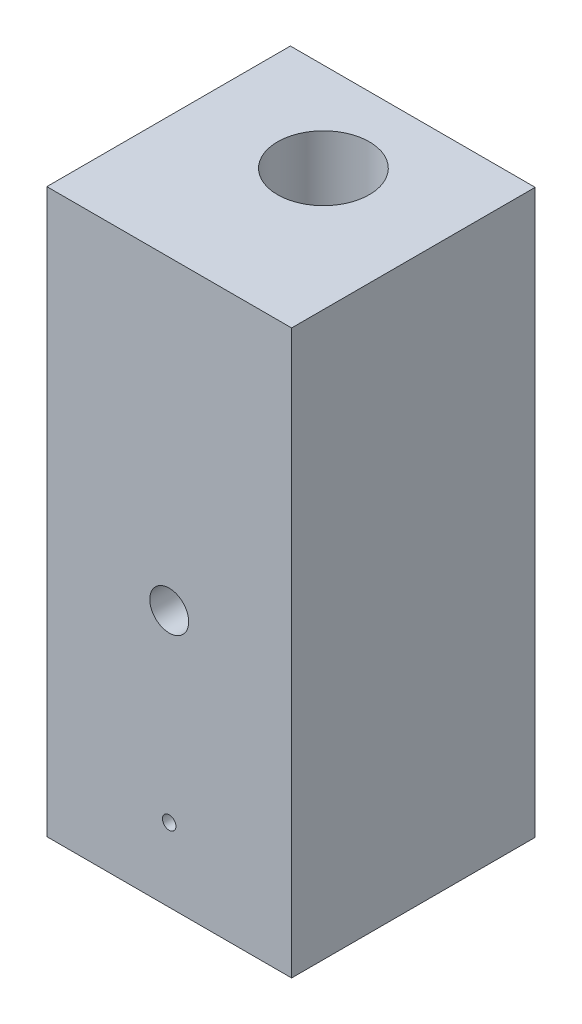
ISO-10303-21;
HEADER;
FILE_DESCRIPTION(('STEP AP214'),'2;1');
FILE_NAME('part.step','',(''),(''),'','','');
FILE_SCHEMA(('AUTOMOTIVE_DESIGN { 1 0 10303 214 1 1 1 1 }'));
ENDSEC;
DATA;
#1=APPLICATION_CONTEXT('core data for automotive mechanical design processes');
#2=APPLICATION_PROTOCOL_DEFINITION('international standard','automotive_design',2000,#1);
#3=PRODUCT_CONTEXT('',#1,'mechanical');
#4=PRODUCT('Part','Part','',(#3));
#5=PRODUCT_RELATED_PRODUCT_CATEGORY('part','',(#4));
#6=PRODUCT_DEFINITION_FORMATION('','',#4);
#7=PRODUCT_DEFINITION_CONTEXT('part definition',#1,'design');
#8=PRODUCT_DEFINITION('design','',#6,#7);
#9=PRODUCT_DEFINITION_SHAPE('','',#8);
#10=(LENGTH_UNIT() NAMED_UNIT(*) SI_UNIT(.MILLI.,.METRE.));
#11=(NAMED_UNIT(*) PLANE_ANGLE_UNIT() SI_UNIT($,.RADIAN.));
#12=(NAMED_UNIT(*) SI_UNIT($,.STERADIAN.) SOLID_ANGLE_UNIT());
#13=UNCERTAINTY_MEASURE_WITH_UNIT(LENGTH_MEASURE(1.E-05),#10,'distance_accuracy_value','');
#14=(GEOMETRIC_REPRESENTATION_CONTEXT(3) GLOBAL_UNCERTAINTY_ASSIGNED_CONTEXT((#13)) GLOBAL_UNIT_ASSIGNED_CONTEXT((#10,
#11,#12)) REPRESENTATION_CONTEXT('',''));
#15=CARTESIAN_POINT('',(0.,0.,0.));
#16=DIRECTION('',(0.,0.,1.));
#17=DIRECTION('',(1.,0.,0.));
#18=AXIS2_PLACEMENT_3D('',#15,#16,#17);
#19=CARTESIAN_POINT('',(-25.4,58.4200000000003,-25.2729999999999));
#20=DIRECTION('',(1.,0.,0.));
#21=DIRECTION('',(0.,0.,-0.999999999999998));
#22=AXIS2_PLACEMENT_3D('',#19,#20,#21);
#23=PLANE('',#22);
#24=DIRECTION('',(0.,0.,0.999999999999998));
#25=VECTOR('',#24,1.);
#26=CARTESIAN_POINT('',(-25.4,2.35922392732846E-13,-25.2729999999999));
#27=LINE('',#26,#25);
#28=CARTESIAN_POINT('',(-25.4,2.35922392732846E-13,-25.2729999999999));
#29=VERTEX_POINT('',#28);
#30=CARTESIAN_POINT('',(-25.4,0.,0.));
#31=VERTEX_POINT('',#30);
#32=EDGE_CURVE('E128',#29,#31,#27,.T.);
#33=ORIENTED_EDGE('',*,*,#32,.T.);
#34=DIRECTION('',(0.,-1.,0.));
#35=VECTOR('',#34,1.);
#36=CARTESIAN_POINT('',(-25.4,58.4200000000002,0.));
#37=LINE('',#36,#35);
#38=CARTESIAN_POINT('',(-25.4,58.4200000000002,0.));
#39=VERTEX_POINT('',#38);
#40=EDGE_CURVE('E149',#39,#31,#37,.T.);
#41=ORIENTED_EDGE('',*,*,#40,.F.);
#42=DIRECTION('',(0.,0.,0.999999999999998));
#43=VECTOR('',#42,1.);
#44=CARTESIAN_POINT('',(-25.4,58.4200000000003,-25.2729999999999));
#45=LINE('',#44,#43);
#46=CARTESIAN_POINT('',(-25.4,58.4200000000003,-25.2729999999999));
#47=VERTEX_POINT('',#46);
#48=EDGE_CURVE('E129',#47,#39,#45,.T.);
#49=ORIENTED_EDGE('',*,*,#48,.F.);
#50=DIRECTION('',(0.,-1.,0.));
#51=VECTOR('',#50,1.);
#52=CARTESIAN_POINT('',(-25.4,58.4200000000003,-25.2729999999999));
#53=LINE('',#52,#51);
#54=EDGE_CURVE('E135',#47,#29,#53,.T.);
#55=ORIENTED_EDGE('',*,*,#54,.T.);
#56=EDGE_LOOP('',(#33,#41,#49,#55));
#57=FACE_BOUND('',#56,.T.);
#58=ADVANCED_FACE('F40',(#57),#23,.F.);
#59=CARTESIAN_POINT('',(-25.4,58.4200000000002,0.));
#60=DIRECTION('',(0.,0.,-0.999999999999998));
#61=DIRECTION('',(-1.,0.,0.));
#62=AXIS2_PLACEMENT_3D('',#59,#60,#61);
#63=PLANE('',#62);
#64=CARTESIAN_POINT('',(-12.6999999999999,26.6700000000002,0.));
#65=DIRECTION('',(0.,0.,0.999999999999998));
#66=DIRECTION('',(1.,0.,0.));
#67=AXIS2_PLACEMENT_3D('',#64,#65,#66);
#68=CIRCLE('',#67,2.0193);
#69=CARTESIAN_POINT('',(-10.6806999999999,26.6700000000002,0.));
#70=VERTEX_POINT('',#69);
#71=EDGE_CURVE('E117',#70,#70,#68,.T.);
#72=ORIENTED_EDGE('',*,*,#71,.F.);
#73=EDGE_LOOP('',(#72));
#74=FACE_BOUND('',#73,.T.);
#75=CARTESIAN_POINT('',(-12.7,7.62,0.));
#76=DIRECTION('',(0.,0.,0.999999999999998));
#77=DIRECTION('',(1.,0.,0.));
#78=AXIS2_PLACEMENT_3D('',#75,#76,#77);
#79=CIRCLE('',#78,0.698499999999989);
#80=CARTESIAN_POINT('',(-12.0015,7.62,0.));
#81=VERTEX_POINT('',#80);
#82=EDGE_CURVE('E125',#81,#81,#79,.T.);
#83=ORIENTED_EDGE('',*,*,#82,.F.);
#84=EDGE_LOOP('',(#83));
#85=FACE_BOUND('',#84,.T.);
#86=DIRECTION('',(1.,0.,0.));
#87=VECTOR('',#86,1.);
#88=CARTESIAN_POINT('',(-25.4,0.,0.));
#89=LINE('',#88,#87);
#90=CARTESIAN_POINT('',(0.,0.,0.));
#91=VERTEX_POINT('',#90);
#92=EDGE_CURVE('E138',#31,#91,#89,.T.);
#93=ORIENTED_EDGE('',*,*,#92,.T.);
#94=DIRECTION('',(0.,-1.,0.));
#95=VECTOR('',#94,1.);
#96=CARTESIAN_POINT('',(0.,58.4200000000002,0.));
#97=LINE('',#96,#95);
#98=CARTESIAN_POINT('',(0.,58.4200000000002,0.));
#99=VERTEX_POINT('',#98);
#100=EDGE_CURVE('E146',#99,#91,#97,.T.);
#101=ORIENTED_EDGE('',*,*,#100,.F.);
#102=DIRECTION('',(1.,0.,0.));
#103=VECTOR('',#102,1.);
#104=CARTESIAN_POINT('',(-25.4,58.4200000000002,0.));
#105=LINE('',#104,#103);
#106=EDGE_CURVE('E97',#39,#99,#105,.T.);
#107=ORIENTED_EDGE('',*,*,#106,.F.);
#108=ORIENTED_EDGE('',*,*,#40,.T.);
#109=EDGE_LOOP('',(#93,#101,#107,#108));
#110=FACE_BOUND('',#109,.T.);
#111=ADVANCED_FACE('F172',(#74,#85,#110),#63,.F.);
#112=CARTESIAN_POINT('',(0.,58.4200000000003,-25.2729999999999));
#113=DIRECTION('',(-1.,0.,0.));
#114=DIRECTION('',(0.,0.,0.999999999999998));
#115=AXIS2_PLACEMENT_3D('',#112,#113,#114);
#116=PLANE('',#115);
#117=DIRECTION('',(0.,0.,-0.999999999999998));
#118=VECTOR('',#117,1.);
#119=CARTESIAN_POINT('',(0.,0.,-25.2729999999999));
#120=LINE('',#119,#118);
#121=CARTESIAN_POINT('',(0.,0.,-25.2729999999999));
#122=VERTEX_POINT('',#121);
#123=EDGE_CURVE('E140',#91,#122,#120,.T.);
#124=ORIENTED_EDGE('',*,*,#123,.T.);
#125=DIRECTION('',(0.,-1.,0.));
#126=VECTOR('',#125,1.);
#127=CARTESIAN_POINT('',(0.,58.4200000000003,-25.2729999999999));
#128=LINE('',#127,#126);
#129=CARTESIAN_POINT('',(0.,58.4200000000003,-25.2729999999999));
#130=VERTEX_POINT('',#129);
#131=EDGE_CURVE('E144',#130,#122,#128,.T.);
#132=ORIENTED_EDGE('',*,*,#131,.F.);
#133=DIRECTION('',(0.,0.,-0.999999999999998));
#134=VECTOR('',#133,1.);
#135=CARTESIAN_POINT('',(0.,58.4200000000003,-25.2729999999999));
#136=LINE('',#135,#134);
#137=EDGE_CURVE('E132',#99,#130,#136,.T.);
#138=ORIENTED_EDGE('',*,*,#137,.F.);
#139=ORIENTED_EDGE('',*,*,#100,.T.);
#140=EDGE_LOOP('',(#124,#132,#138,#139));
#141=FACE_BOUND('',#140,.T.);
#142=ADVANCED_FACE('F177',(#141),#116,.F.);
#143=CARTESIAN_POINT('',(-25.4,58.4200000000003,-25.2729999999999));
#144=DIRECTION('',(0.,0.,0.999999999999998));
#145=DIRECTION('',(1.,0.,0.));
#146=AXIS2_PLACEMENT_3D('',#143,#144,#145);
#147=PLANE('',#146);
#148=DIRECTION('',(-1.,0.,0.));
#149=VECTOR('',#148,1.);
#150=CARTESIAN_POINT('',(-25.4,2.35922392732846E-13,-25.2729999999999));
#151=LINE('',#150,#149);
#152=EDGE_CURVE('E89',#122,#29,#151,.T.);
#153=ORIENTED_EDGE('',*,*,#152,.T.);
#154=ORIENTED_EDGE('',*,*,#54,.F.);
#155=DIRECTION('',(-1.,0.,0.));
#156=VECTOR('',#155,1.);
#157=CARTESIAN_POINT('',(-25.4,58.4200000000003,-25.2729999999999));
#158=LINE('',#157,#156);
#159=EDGE_CURVE('E68',#130,#47,#158,.T.);
#160=ORIENTED_EDGE('',*,*,#159,.F.);
#161=ORIENTED_EDGE('',*,*,#131,.T.);
#162=EDGE_LOOP('',(#153,#154,#160,#161));
#163=FACE_BOUND('',#162,.T.);
#164=ADVANCED_FACE('F190',(#163),#147,.F.);
#165=CARTESIAN_POINT('',(0.,58.4200000000002,0.));
#166=DIRECTION('',(0.,1.,0.));
#167=DIRECTION('',(0.,0.,0.999999999999998));
#168=AXIS2_PLACEMENT_3D('',#165,#166,#167);
#169=PLANE('',#168);
#170=CARTESIAN_POINT('',(-12.7,58.4200000000003,-16.0019999999999));
#171=DIRECTION('',(0.,1.,0.));
#172=DIRECTION('',(0.,0.,0.999999999999998));
#173=AXIS2_PLACEMENT_3D('',#170,#171,#172);
#174=CIRCLE('',#173,4.76249999999999);
#175=CARTESIAN_POINT('',(-12.7,58.4200000000003,-11.2395));
#176=VERTEX_POINT('',#175);
#177=EDGE_CURVE('E116',#176,#176,#174,.T.);
#178=ORIENTED_EDGE('',*,*,#177,.F.);
#179=EDGE_LOOP('',(#178));
#180=FACE_BOUND('',#179,.T.);
#181=ORIENTED_EDGE('',*,*,#48,.T.);
#182=ORIENTED_EDGE('',*,*,#106,.T.);
#183=ORIENTED_EDGE('',*,*,#137,.T.);
#184=ORIENTED_EDGE('',*,*,#159,.T.);
#185=EDGE_LOOP('',(#181,#182,#183,#184));
#186=FACE_BOUND('',#185,.T.);
#187=ADVANCED_FACE('F188',(#180,#186),#169,.T.);
#188=CARTESIAN_POINT('',(0.,0.,0.));
#189=DIRECTION('',(0.,1.,0.));
#190=DIRECTION('',(0.,0.,0.999999999999998));
#191=AXIS2_PLACEMENT_3D('',#188,#189,#190);
#192=PLANE('',#191);
#193=ORIENTED_EDGE('',*,*,#32,.F.);
#194=ORIENTED_EDGE('',*,*,#152,.F.);
#195=ORIENTED_EDGE('',*,*,#123,.F.);
#196=ORIENTED_EDGE('',*,*,#92,.F.);
#197=EDGE_LOOP('',(#193,#194,#195,#196));
#198=FACE_BOUND('',#197,.T.);
#199=ADVANCED_FACE('F183',(#198),#192,.F.);
#200=CARTESIAN_POINT('',(-12.7,7.62,0.));
#201=DIRECTION('',(0.,0.,0.999999999999998));
#202=DIRECTION('',(1.,0.,0.));
#203=AXIS2_PLACEMENT_3D('',#200,#201,#202);
#204=CYLINDRICAL_SURFACE('',#203,0.698499999999988);
#205=CARTESIAN_POINT('',(-12.0050214050058,7.6900500000002,-11.1726673851839));
#206=CARTESIAN_POINT('',(-12.0020412705705,7.66022917417571,-11.223241267845));
#207=CARTESIAN_POINT('',(-12.00093379731,7.63024628229548,-11.2738434402621));
#208=CARTESIAN_POINT('',(-12.0026317196288,7.57000730792529,-11.3749531695365));
#209=CARTESIAN_POINT('',(-12.0054448958452,7.53975080092828,-11.4254603385015));
#210=CARTESIAN_POINT('',(-12.015181273317,7.4790324951242,-11.5261958210679));
#211=CARTESIAN_POINT('',(-12.0221183359235,7.44857034809296,-11.5764226148807));
#212=CARTESIAN_POINT('',(-12.0404835132236,7.38772779892665,-11.6760501457307));
#213=CARTESIAN_POINT('',(-12.0519073779085,7.35734734674734,-11.7254516185004));
#214=CARTESIAN_POINT('',(-12.0789895842805,7.29870878938825,-11.8200718975552));
#215=CARTESIAN_POINT('',(-12.0943514216076,7.27043307046281,-11.8653634081447));
#216=CARTESIAN_POINT('',(-12.130316531187,7.21444867256865,-11.9543272501982));
#217=CARTESIAN_POINT('',(-12.1509266083328,7.1867407806304,-11.9979973945127));
#218=CARTESIAN_POINT('',(-12.1986830168624,7.13223297051394,-12.0831735421645));
#219=CARTESIAN_POINT('',(-12.2259030006745,7.10544746845078,-12.124648247274));
#220=CARTESIAN_POINT('',(-12.2881750029129,7.0543899217638,-12.2029969027126));
#221=CARTESIAN_POINT('',(-12.3231896838198,7.03010667637082,-12.2398915217076));
#222=CARTESIAN_POINT('',(-12.3827845368245,6.99727142833529,-12.2893777140666));
#223=CARTESIAN_POINT('',(-12.4038937864468,6.98690191560401,-12.3049305698557));
#224=CARTESIAN_POINT('',(-12.4485789045019,6.96786548041233,-12.333377818346));
#225=CARTESIAN_POINT('',(-12.4721546859203,6.95919849792098,-12.3462723047816));
#226=CARTESIAN_POINT('',(-12.5219312005228,6.94407310894033,-12.3687109483714));
#227=CARTESIAN_POINT('',(-12.548160573044,6.9376430835452,-12.3782120904729));
#228=CARTESIAN_POINT('',(-12.602371028045,6.92781170575913,-12.3927160989936));
#229=CARTESIAN_POINT('',(-12.6303486824288,6.92440461373043,-12.3977274902716));
#230=CARTESIAN_POINT('',(-12.6831082420516,6.92127346065017,-12.4023327135503));
#231=CARTESIAN_POINT('',(-12.7078089734466,6.92111257637747,-12.4025690963072));
#232=CARTESIAN_POINT('',(-12.7568301462076,6.92338364927458,-12.3992292622064));
#233=CARTESIAN_POINT('',(-12.7811505401118,6.92581592746363,-12.3956525733114));
#234=CARTESIAN_POINT('',(-12.8264821783092,6.93269862779586,-12.3855087885848));
#235=CARTESIAN_POINT('',(-12.8475938714546,6.93694685007801,-12.3792410812116));
#236=CARTESIAN_POINT('',(-12.888493341564,6.94708324409308,-12.364246343505));
#237=CARTESIAN_POINT('',(-12.9082807767672,6.95297183715944,-12.355518681319));
#238=CARTESIAN_POINT('',(-12.9568502466665,6.96968785738562,-12.3306639104931));
#239=CARTESIAN_POINT('',(-12.9845799211385,6.98144869052194,-12.3131095896));
#240=CARTESIAN_POINT('',(-13.0363778181832,7.00714389985838,-12.2745324982609));
#241=CARTESIAN_POINT('',(-13.0604358325009,7.02108412540108,-12.253500384626));
#242=CARTESIAN_POINT('',(-13.118952686707,7.05941696692092,-12.1953133553278));
#243=CARTESIAN_POINT('',(-13.1506947346067,7.08496038967897,-12.1562048810105));
#244=CARTESIAN_POINT('',(-13.2069665051188,7.13793885193859,-12.0743028027277));
#245=CARTESIAN_POINT('',(-13.2314778619485,7.16537849350842,-12.0315001657243));
#246=CARTESIAN_POINT('',(-13.2723598441239,7.21837095488219,-11.9481061322127));
#247=CARTESIAN_POINT('',(-13.2893046880233,7.24383206467138,-11.9077321943883));
#248=CARTESIAN_POINT('',(-13.3190896657059,7.29517429260609,-11.8257291955556));
#249=CARTESIAN_POINT('',(-13.3319263785554,7.32105574203324,-11.7840991199328));
#250=CARTESIAN_POINT('',(-13.3539913852552,7.37302805106372,-11.6999535197023));
#251=CARTESIAN_POINT('',(-13.3632147688464,7.39911914679496,-11.6574368723212));
#252=CARTESIAN_POINT('',(-13.3783757416931,7.45133765704207,-11.5718390595766));
#253=CARTESIAN_POINT('',(-13.3843125519111,7.47746507869843,-11.5287577628457));
#254=CARTESIAN_POINT('',(-13.3940318642213,7.53492693949516,-11.4335011390342));
#255=CARTESIAN_POINT('',(-13.397136376946,7.5662464187946,-11.3812477544951));
#256=CARTESIAN_POINT('',(-13.399128958079,7.62845114362982,-11.276872908243));
#257=CARTESIAN_POINT('',(-13.3980450243889,7.65933789218389,-11.2247528929705));
#258=CARTESIAN_POINT('',(-13.3949785949941,7.69005000000013,-11.1726673851839));
#259=B_SPLINE_CURVE_WITH_KNOTS('',3,(#205,#206,#207,#208,#209,#210,#211,#212,#213,#214,#215,
#216,#217,#218,#219,#220,#221,#222,#223,#224,#225,#226,#227,#228,#229,#230,#231,#232,#233,#234,
#235,#236,#237,#238,#239,#240,#241,#242,#243,#244,#245,#246,#247,#248,#249,#250,#251,#252,#253,
#254,#255,#256,#257,#258),.UNSPECIFIED.,.F.,.F.,(4,2,2,2,2,2,2,2,2,2,2,2,2,2,2,2,2,2,2,2,2,2,2,
2,2,2,4),(0.,0.176347230871792,0.353044926461322,0.530339929595852,0.707467398027392,
0.873925847820395,1.04060123730469,1.20922671693009,1.37706120661977,1.46142735325517,
1.54579052461926,1.63118803163851,1.71642304542903,1.79009859573353,1.86378326772445,
1.93081036260442,1.99785468946487,2.10184514687969,2.20611965710543,2.37459876081644,
2.54350218386999,2.69523752358917,2.8470988899567,2.9991659152156,3.15126897048523,
3.33411600047879,3.51574290059396),.UNSPECIFIED.);
#260=CARTESIAN_POINT('',(-12.0015,7.62000000000013,-11.2910018042882));
#261=VERTEX_POINT('',#260);
#262=CARTESIAN_POINT('',(-13.3985000000006,7.6200000000002,-11.2910018042881));
#263=VERTEX_POINT('',#262);
#264=EDGE_CURVE('E53',#261,#263,#259,.T.);
#265=ORIENTED_EDGE('',*,*,#264,.T.);
#266=CARTESIAN_POINT('',(-13.3985,7.62000000000022,-11.2910018042882));
#267=CARTESIAN_POINT('',(-13.3985343671812,7.65907219760987,-11.2910207458607));
#268=CARTESIAN_POINT('',(-13.3952237812843,7.69812962345121,-11.2905162326507));
#269=CARTESIAN_POINT('',(-13.3821720062785,7.77508675138328,-11.2886014994806));
#270=CARTESIAN_POINT('',(-13.3724384168606,7.81298776635789,-11.2871923499385));
#271=CARTESIAN_POINT('',(-13.3467952925011,7.8866114309862,-11.2836084358949));
#272=CARTESIAN_POINT('',(-13.3308840577612,7.92233347795708,-11.2814334606893));
#273=CARTESIAN_POINT('',(-13.2933578315365,7.99060098881046,-11.2765696716861));
#274=CARTESIAN_POINT('',(-13.2717430329434,8.02314656006882,-11.2738808752664));
#275=CARTESIAN_POINT('',(-13.223246755594,8.08438236427959,-11.2682682298601));
#276=CARTESIAN_POINT('',(-13.1963307399931,8.11304511537536,-11.2653429179124));
#277=CARTESIAN_POINT('',(-13.1380681629796,8.16546713306153,-11.2595999723489));
#278=CARTESIAN_POINT('',(-13.1067209260167,8.18922565062838,-11.2567823552347));
#279=CARTESIAN_POINT('',(-13.0403099618181,8.23126318176781,-11.2515570642992));
#280=CARTESIAN_POINT('',(-13.0052299118932,8.24951666941761,-11.2491513218768));
#281=CARTESIAN_POINT('',(-12.9324628295792,8.27986128751393,-11.2450373489438));
#282=CARTESIAN_POINT('',(-12.8947760808118,8.29195308718855,-11.2433290426877));
#283=CARTESIAN_POINT('',(-12.8181499566706,8.30954842768034,-11.2408126400386));
#284=CARTESIAN_POINT('',(-12.7792214878582,8.31509854101332,-11.239998182925));
#285=CARTESIAN_POINT('',(-12.7009768947978,8.31959756188061,-11.2393394493343));
#286=CARTESIAN_POINT('',(-12.661660781937,8.31854666274989,-11.2394951444428));
#287=CARTESIAN_POINT('',(-12.5840766296107,8.30991008557629,-11.2407541168799));
#288=CARTESIAN_POINT('',(-12.5458028576223,8.30237469023009,-11.2418501027199));
#289=CARTESIAN_POINT('',(-12.4710692122769,8.281061943624,-11.2448583713591));
#290=CARTESIAN_POINT('',(-12.4346093732484,8.26728447428339,-11.2467706696003));
#291=CARTESIAN_POINT('',(-12.3643849916882,8.23382664190187,-11.2512092771374));
#292=CARTESIAN_POINT('',(-12.3306307725357,8.21412491722009,-11.2537378020587));
#293=CARTESIAN_POINT('',(-12.2668898883796,8.16939417328442,-11.2591267594733));
#294=CARTESIAN_POINT('',(-12.2369033108104,8.14436503043527,-11.2619871996663));
#295=CARTESIAN_POINT('',(-12.181254876372,8.08941350913139,-11.2677523145816));
#296=CARTESIAN_POINT('',(-12.1556357339389,8.05944787816127,-11.2706571534663));
#297=CARTESIAN_POINT('',(-12.1097757478662,7.99560911018005,-11.2761585988039));
#298=CARTESIAN_POINT('',(-12.0895364686272,7.96173484068074,-11.2787551154791));
#299=CARTESIAN_POINT('',(-12.0550055699017,7.89099210690942,-11.2833462242533));
#300=CARTESIAN_POINT('',(-12.0407217105297,7.85411981036078,-11.2853400300757));
#301=CARTESIAN_POINT('',(-12.0185819591085,7.77848987093438,-11.2884872054908));
#302=CARTESIAN_POINT('',(-12.01071642505,7.73973514910446,-11.2896418354594));
#303=CARTESIAN_POINT('',(-12.0046128658483,7.68724482254346,-11.2905411910765));
#304=CARTESIAN_POINT('',(-12.0034450177583,7.67381104818646,-11.2907137834529));
#305=CARTESIAN_POINT('',(-12.0018896164696,7.64692010948942,-11.2909439642406));
#306=CARTESIAN_POINT('',(-12.0015007520823,7.63346302267714,-11.2910017459005));
#307=CARTESIAN_POINT('',(-12.0015,7.62000000000013,-11.2910018042882));
#308=B_SPLINE_CURVE_WITH_KNOTS('',3,(#266,#267,#268,#269,#270,#271,#272,#273,#274,#275,#276,
#277,#278,#279,#280,#281,#282,#283,#284,#285,#286,#287,#288,#289,#290,#291,#292,#293,#294,#295,
#296,#297,#298,#299,#300,#301,#302,#303,#304,#305,#306,#307),.UNSPECIFIED.,.F.,.F.,(4,2,2,2,2,2,
2,2,2,2,2,2,2,2,2,2,2,2,2,2,4),(0.,0.117051326514172,0.233964405755074,0.350909676818209,
0.467850993356415,0.585580995696737,0.703328965656846,0.821614803971634,0.939887792384472,
1.05731356869405,1.17473590577339,1.29125583685846,1.40777797223176,1.52472540595297,
1.64167555313236,1.7597109648983,1.87778066250796,1.9960037317243,2.11404887019174,
2.15448847051979,2.19485994535619),.UNSPECIFIED.);
#309=EDGE_CURVE('E11',#263,#261,#308,.T.);
#310=ORIENTED_EDGE('',*,*,#309,.T.);
#311=EDGE_LOOP('',(#265,#310));
#312=FACE_BOUND('',#311,.T.);
#313=ORIENTED_EDGE('',*,*,#82,.T.);
#314=EDGE_LOOP('',(#313));
#315=FACE_BOUND('',#314,.T.);
#316=ADVANCED_FACE('F156',(#312,#315),#204,.F.);
#317=CARTESIAN_POINT('',(-12.7,58.4200000000003,-16.0019999999999));
#318=DIRECTION('',(0.,1.,0.));
#319=DIRECTION('',(0.,0.,0.999999999999998));
#320=AXIS2_PLACEMENT_3D('',#317,#318,#319);
#321=CYLINDRICAL_SURFACE('',#320,4.76249999999999);
#322=ORIENTED_EDGE('',*,*,#177,.T.);
#323=EDGE_LOOP('',(#322));
#324=FACE_BOUND('',#323,.T.);
#325=CARTESIAN_POINT('',(-12.7,7.62000000000011,-16.0019999999999));
#326=DIRECTION('',(0.,1.,0.));
#327=DIRECTION('',(0.,0.,0.999999999999998));
#328=AXIS2_PLACEMENT_3D('',#325,#326,#327);
#329=CIRCLE('',#328,4.76249999999998);
#330=EDGE_CURVE('E59',#261,#263,#329,.T.);
#331=ORIENTED_EDGE('',*,*,#330,.F.);
#332=ORIENTED_EDGE('',*,*,#309,.F.);
#333=EDGE_LOOP('',(#331,#332));
#334=FACE_BOUND('',#333,.T.);
#335=ADVANCED_FACE('F161',(#324,#334),#321,.F.);
#336=CARTESIAN_POINT('',(-12.7,7.62000000000011,-16.0019999999999));
#337=DIRECTION('',(0.,1.,0.));
#338=DIRECTION('',(0.,0.,0.999999999999998));
#339=AXIS2_PLACEMENT_3D('',#336,#337,#338);
#340=CONICAL_SURFACE('',#339,4.76249999999998,1.02974425867665);
#341=CARTESIAN_POINT('',(-12.7,4.75840130188136,-16.002));
#342=VERTEX_POINT('',#341);
#343=VERTEX_LOOP('',#342);
#344=FACE_BOUND('',#343,.T.);
#345=ORIENTED_EDGE('',*,*,#330,.T.);
#346=ORIENTED_EDGE('',*,*,#264,.F.);
#347=EDGE_LOOP('',(#345,#346));
#348=FACE_BOUND('',#347,.T.);
#349=ADVANCED_FACE('F110',(#344,#348),#340,.F.);
#350=CARTESIAN_POINT('',(-12.6999999999999,26.6700000000002,-8.94668215199759));
#351=DIRECTION('',(0.,0.,0.999999999999998));
#352=DIRECTION('',(1.,0.,0.));
#353=AXIS2_PLACEMENT_3D('',#350,#351,#352);
#354=CONICAL_SURFACE('',#353,2.0193,1.02974425867665);
#355=CARTESIAN_POINT('',(-12.6999999999999,26.6700000000002,-10.1599999999999));
#356=VERTEX_POINT('',#355);
#357=VERTEX_LOOP('',#356);
#358=FACE_BOUND('',#357,.T.);
#359=CARTESIAN_POINT('',(-12.6999999999999,26.6700000000002,-8.94668215199759));
#360=DIRECTION('',(0.,0.,0.999999999999998));
#361=DIRECTION('',(1.,0.,0.));
#362=AXIS2_PLACEMENT_3D('',#359,#360,#361);
#363=CIRCLE('',#362,2.0193);
#364=CARTESIAN_POINT('',(-10.6806999999999,26.6700000000002,-8.94668215199759));
#365=VERTEX_POINT('',#364);
#366=EDGE_CURVE('E114',#365,#365,#363,.T.);
#367=ORIENTED_EDGE('',*,*,#366,.T.);
#368=EDGE_LOOP('',(#367));
#369=FACE_BOUND('',#368,.T.);
#370=ADVANCED_FACE('F106',(#358,#369),#354,.F.);
#371=CARTESIAN_POINT('',(-12.6999999999999,26.6700000000002,0.));
#372=DIRECTION('',(0.,0.,0.999999999999998));
#373=DIRECTION('',(1.,0.,0.));
#374=AXIS2_PLACEMENT_3D('',#371,#372,#373);
#375=CYLINDRICAL_SURFACE('',#374,2.0193);
#376=CARTESIAN_POINT('',(-10.6806999999999,26.6700000000002,-8.94668215199759));
#377=CARTESIAN_POINT('',(-10.6806999999999,26.6700000000002,-8.85348754624762));
#378=CARTESIAN_POINT('',(-10.6806999999999,26.6700000000002,-8.76029294049764));
#379=CARTESIAN_POINT('',(-10.6806999999999,26.6700000000002,-8.57390372899769));
#380=CARTESIAN_POINT('',(-10.6806999999999,26.6700000000002,-8.48070912324772));
#381=CARTESIAN_POINT('',(-10.6806999999999,26.6700000000002,-8.29431991174777));
#382=CARTESIAN_POINT('',(-10.6806999999999,26.6700000000002,-8.2011253059978));
#383=CARTESIAN_POINT('',(-10.6806999999999,26.6700000000002,-8.01473609449785));
#384=CARTESIAN_POINT('',(-10.6806999999999,26.6700000000002,-7.92154148874787));
#385=CARTESIAN_POINT('',(-10.6806999999999,26.6700000000002,-7.73515227724793));
#386=CARTESIAN_POINT('',(-10.6806999999999,26.6700000000002,-7.64195767149795));
#387=CARTESIAN_POINT('',(-10.6806999999999,26.6700000000002,-7.455568459998));
#388=CARTESIAN_POINT('',(-10.6806999999999,26.6700000000002,-7.36237385424803));
#389=CARTESIAN_POINT('',(-10.6806999999999,26.6700000000002,-7.17598464274808));
#390=CARTESIAN_POINT('',(-10.6806999999999,26.6700000000002,-7.08279003699811));
#391=CARTESIAN_POINT('',(-10.6806999999999,26.6700000000002,-6.89640082549816));
#392=CARTESIAN_POINT('',(-10.6806999999999,26.6700000000002,-6.80320621974818));
#393=CARTESIAN_POINT('',(-10.6806999999999,26.6700000000002,-6.61681700824824));
#394=CARTESIAN_POINT('',(-10.6806999999999,26.6700000000002,-6.52362240249826));
#395=CARTESIAN_POINT('',(-10.6806999999999,26.6700000000002,-6.33723319099831));
#396=CARTESIAN_POINT('',(-10.6806999999999,26.6700000000002,-6.24403858524834));
#397=CARTESIAN_POINT('',(-10.6806999999999,26.6700000000002,-6.05764937374839));
#398=CARTESIAN_POINT('',(-10.6806999999999,26.6700000000002,-5.96445476799842));
#399=CARTESIAN_POINT('',(-10.6806999999999,26.6700000000002,-5.77806555649847));
#400=CARTESIAN_POINT('',(-10.6806999999999,26.6700000000002,-5.68487095074849));
#401=CARTESIAN_POINT('',(-10.6806999999999,26.6700000000002,-5.49848173924854));
#402=CARTESIAN_POINT('',(-10.6806999999999,26.6700000000002,-5.40528713349857));
#403=CARTESIAN_POINT('',(-10.6806999999999,26.6700000000002,-5.21889792199862));
#404=CARTESIAN_POINT('',(-10.6806999999999,26.6700000000002,-5.12570331624865));
#405=CARTESIAN_POINT('',(-10.6806999999999,26.6700000000002,-4.9393141047487));
#406=CARTESIAN_POINT('',(-10.6806999999999,26.6700000000002,-4.84611949899872));
#407=CARTESIAN_POINT('',(-10.6806999999999,26.6700000000002,-4.65973028749878));
#408=CARTESIAN_POINT('',(-10.6806999999999,26.6700000000002,-4.5665356817488));
#409=CARTESIAN_POINT('',(-10.6806999999999,26.6700000000002,-4.38014647024885));
#410=CARTESIAN_POINT('',(-10.6806999999999,26.6700000000002,-4.28695186449888));
#411=CARTESIAN_POINT('',(-10.6806999999999,26.6700000000002,-4.10056265299893));
#412=CARTESIAN_POINT('',(-10.6806999999999,26.6700000000002,-4.00736804724896));
#413=CARTESIAN_POINT('',(-10.6806999999999,26.6700000000002,-3.82097883574901));
#414=CARTESIAN_POINT('',(-10.6806999999999,26.6700000000002,-3.72778422999903));
#415=CARTESIAN_POINT('',(-10.6806999999999,26.6700000000002,-3.54139501849908));
#416=CARTESIAN_POINT('',(-10.6806999999999,26.6700000000002,-3.44820041274911));
#417=CARTESIAN_POINT('',(-10.6806999999999,26.6700000000002,-3.26181120124916));
#418=CARTESIAN_POINT('',(-10.6806999999999,26.6700000000002,-3.16861659549919));
#419=CARTESIAN_POINT('',(-10.6806999999999,26.6700000000002,-2.98222738399924));
#420=CARTESIAN_POINT('',(-10.6806999999999,26.6700000000002,-2.88903277824926));
#421=CARTESIAN_POINT('',(-10.6806999999999,26.6700000000002,-2.70264356674932));
#422=CARTESIAN_POINT('',(-10.6806999999999,26.6700000000002,-2.60944896099934));
#423=CARTESIAN_POINT('',(-10.6806999999999,26.6700000000002,-2.42305974949939));
#424=CARTESIAN_POINT('',(-10.6806999999999,26.6700000000002,-2.32986514374942));
#425=CARTESIAN_POINT('',(-10.6806999999999,26.6700000000002,-2.14347593224947));
#426=CARTESIAN_POINT('',(-10.6806999999999,26.6700000000002,-2.0502813264995));
#427=CARTESIAN_POINT('',(-10.6806999999999,26.6700000000002,-1.86389211499955));
#428=CARTESIAN_POINT('',(-10.6806999999999,26.6700000000002,-1.77069750924957));
#429=CARTESIAN_POINT('',(-10.6806999999999,26.6700000000002,-1.58430829774962));
#430=CARTESIAN_POINT('',(-10.6806999999999,26.6700000000002,-1.49111369199965));
#431=CARTESIAN_POINT('',(-10.6806999999999,26.6700000000002,-1.3047244804997));
#432=CARTESIAN_POINT('',(-10.6806999999999,26.6700000000002,-1.21152987474973));
#433=CARTESIAN_POINT('',(-10.6806999999999,26.6700000000002,-1.02514066324978));
#434=CARTESIAN_POINT('',(-10.6806999999999,26.6700000000002,-0.931946057499805));
#435=CARTESIAN_POINT('',(-10.6806999999999,26.6700000000002,-0.745556845999856));
#436=CARTESIAN_POINT('',(-10.6806999999999,26.6700000000002,-0.652362240249882));
#437=CARTESIAN_POINT('',(-10.6806999999999,26.6700000000002,-0.465973028749934));
#438=CARTESIAN_POINT('',(-10.6806999999999,26.6700000000002,-0.37277842299996));
#439=CARTESIAN_POINT('',(-10.6806999999999,26.6700000000002,-0.186389211500011));
#440=CARTESIAN_POINT('',(-10.6806999999999,26.6700000000002,-0.0931946057500369));
#441=CARTESIAN_POINT('',(-10.6806999999999,26.6700000000002,0.));
#442=B_SPLINE_CURVE_WITH_KNOTS('',3,(#376,#377,#378,#379,#380,#381,#382,#383,#384,#385,#386,
#387,#388,#389,#390,#391,#392,#393,#394,#395,#396,#397,#398,#399,#400,#401,#402,#403,#404,#405,
#406,#407,#408,#409,#410,#411,#412,#413,#414,#415,#416,#417,#418,#419,#420,#421,#422,#423,#424,
#425,#426,#427,#428,#429,#430,#431,#432,#433,#434,#435,#436,#437,#438,#439,#440,#441),
.UNSPECIFIED.,.F.,.F.,(4,2,2,2,2,2,2,2,2,2,2,2,2,2,2,2,2,2,2,2,2,2,2,2,2,2,2,2,2,2,2,2,4),(0.,
0.279583817249924,0.559167634499846,0.838751451749768,1.11833526899969,1.39791908624961,
1.67750290349954,1.95708672074946,2.23667053799938,2.51625435524931,2.79583817249923,
3.07542198974915,3.35500580699907,3.634589624249,3.91417344149892,4.19375725874884,
4.47334107599877,4.75292489324869,5.03250871049861,5.31209252774853,5.59167634499846,
5.87126016224838,6.1508439794983,6.43042779674823,6.71001161399815,6.98959543124807,
7.26917924849799,7.54876306574792,7.82834688299784,8.10793070024776,8.38751451749769,
8.66709833474761,8.94668215199753),.UNSPECIFIED.);
#443=EDGE_CURVE('BSEAM109',#365,#70,#442,.T.);
#444=ORIENTED_EDGE('',*,*,#366,.F.);
#445=ORIENTED_EDGE('',*,*,#71,.T.);
#446=ORIENTED_EDGE('',*,*,#443,.T.);
#447=ORIENTED_EDGE('',*,*,#443,.F.);
#448=EDGE_LOOP('',(#444,#446,#445,#447));
#449=FACE_BOUND('',#448,.T.);
#450=ADVANCED_FACE('F109',(#449),#375,.F.);
#451=CLOSED_SHELL('',(#58,#111,#142,#164,#187,#199,#316,#335,#349,#370,#450));
#452=MANIFOLD_SOLID_BREP('B2',#451);
#453=ADVANCED_BREP_SHAPE_REPRESENTATION('',(#18,#452),#14);
#454=SHAPE_DEFINITION_REPRESENTATION(#9,#453);
ENDSEC;
END-ISO-10303-21;
